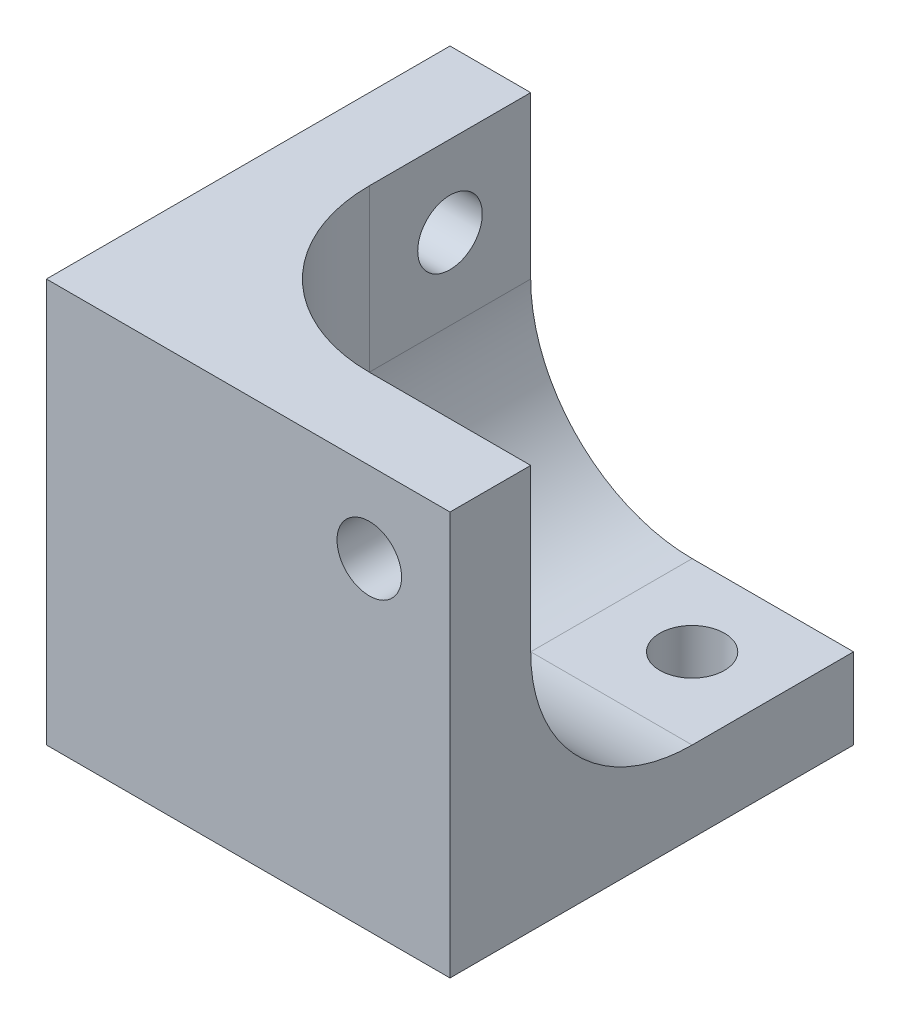
ISO-10303-21;
HEADER;
FILE_DESCRIPTION(('STEP AP214'),'2;1');
FILE_NAME('part.step','',(''),(''),'','','');
FILE_SCHEMA(('AUTOMOTIVE_DESIGN { 1 0 10303 214 1 1 1 1 }'));
ENDSEC;
DATA;
#1=APPLICATION_CONTEXT('core data for automotive mechanical design processes');
#2=APPLICATION_PROTOCOL_DEFINITION('international standard','automotive_design',2000,#1);
#3=PRODUCT_CONTEXT('',#1,'mechanical');
#4=PRODUCT('Part','Part','',(#3));
#5=PRODUCT_RELATED_PRODUCT_CATEGORY('part','',(#4));
#6=PRODUCT_DEFINITION_FORMATION('','',#4);
#7=PRODUCT_DEFINITION_CONTEXT('part definition',#1,'design');
#8=PRODUCT_DEFINITION('design','',#6,#7);
#9=PRODUCT_DEFINITION_SHAPE('','',#8);
#10=(LENGTH_UNIT() NAMED_UNIT(*) SI_UNIT(.MILLI.,.METRE.));
#11=(NAMED_UNIT(*) PLANE_ANGLE_UNIT() SI_UNIT($,.RADIAN.));
#12=(NAMED_UNIT(*) SI_UNIT($,.STERADIAN.) SOLID_ANGLE_UNIT());
#13=UNCERTAINTY_MEASURE_WITH_UNIT(LENGTH_MEASURE(1.E-05),#10,'distance_accuracy_value','');
#14=(GEOMETRIC_REPRESENTATION_CONTEXT(3) GLOBAL_UNCERTAINTY_ASSIGNED_CONTEXT((#13)) GLOBAL_UNIT_ASSIGNED_CONTEXT((#10,
#11,#12)) REPRESENTATION_CONTEXT('',''));
#15=CARTESIAN_POINT('',(0.,0.,0.));
#16=DIRECTION('',(0.,0.,1.));
#17=DIRECTION('',(1.,0.,0.));
#18=AXIS2_PLACEMENT_3D('',#15,#16,#17);
#19=CARTESIAN_POINT('',(0.,50.,0.));
#20=DIRECTION('',(1.,0.,0.));
#21=DIRECTION('',(0.,0.,-1.));
#22=AXIS2_PLACEMENT_3D('',#19,#20,#21);
#23=PLANE('',#22);
#24=CARTESIAN_POINT('',(0.,40.,-40.));
#25=DIRECTION('',(-1.,0.,0.));
#26=DIRECTION('',(0.,0.,1.));
#27=AXIS2_PLACEMENT_3D('',#24,#25,#26);
#28=CIRCLE('',#27,4.00000000000001);
#29=CARTESIAN_POINT('',(0.,40.,-36.));
#30=VERTEX_POINT('',#29);
#31=EDGE_CURVE('E155',#30,#30,#28,.T.);
#32=ORIENTED_EDGE('',*,*,#31,.F.);
#33=EDGE_LOOP('',(#32));
#34=FACE_BOUND('',#33,.T.);
#35=DIRECTION('',(0.,0.,1.));
#36=VECTOR('',#35,1.);
#37=CARTESIAN_POINT('',(0.,0.,0.));
#38=LINE('',#37,#36);
#39=CARTESIAN_POINT('',(0.,0.,-50.));
#40=VERTEX_POINT('',#39);
#41=CARTESIAN_POINT('',(0.,0.,0.));
#42=VERTEX_POINT('',#41);
#43=EDGE_CURVE('E197',#40,#42,#38,.T.);
#44=ORIENTED_EDGE('',*,*,#43,.T.);
#45=DIRECTION('',(0.,-1.,0.));
#46=VECTOR('',#45,1.);
#47=CARTESIAN_POINT('',(0.,50.,0.));
#48=LINE('',#47,#46);
#49=CARTESIAN_POINT('',(0.,50.,0.));
#50=VERTEX_POINT('',#49);
#51=EDGE_CURVE('E137',#50,#42,#48,.T.);
#52=ORIENTED_EDGE('',*,*,#51,.F.);
#53=DIRECTION('',(0.,0.,1.));
#54=VECTOR('',#53,1.);
#55=CARTESIAN_POINT('',(0.,50.,0.));
#56=LINE('',#55,#54);
#57=CARTESIAN_POINT('',(0.,50.,-50.));
#58=VERTEX_POINT('',#57);
#59=EDGE_CURVE('E199',#58,#50,#56,.T.);
#60=ORIENTED_EDGE('',*,*,#59,.F.);
#61=DIRECTION('',(0.,-1.,0.));
#62=VECTOR('',#61,1.);
#63=CARTESIAN_POINT('',(0.,50.,-50.));
#64=LINE('',#63,#62);
#65=EDGE_CURVE('E135',#58,#40,#64,.T.);
#66=ORIENTED_EDGE('',*,*,#65,.T.);
#67=EDGE_LOOP('',(#44,#52,#60,#66));
#68=FACE_BOUND('',#67,.T.);
#69=ADVANCED_FACE('F35',(#34,#68),#23,.F.);
#70=CARTESIAN_POINT('',(0.,50.,0.));
#71=DIRECTION('',(0.,0.,-1.));
#72=DIRECTION('',(-1.,0.,0.));
#73=AXIS2_PLACEMENT_3D('',#70,#71,#72);
#74=PLANE('',#73);
#75=CARTESIAN_POINT('',(40.,40.,0.));
#76=DIRECTION('',(0.,0.,1.));
#77=DIRECTION('',(1.,0.,0.));
#78=AXIS2_PLACEMENT_3D('',#75,#76,#77);
#79=CIRCLE('',#78,4.00000000000001);
#80=CARTESIAN_POINT('',(44.,40.,0.));
#81=VERTEX_POINT('',#80);
#82=EDGE_CURVE('E151',#81,#81,#79,.T.);
#83=ORIENTED_EDGE('',*,*,#82,.F.);
#84=EDGE_LOOP('',(#83));
#85=FACE_BOUND('',#84,.T.);
#86=DIRECTION('',(1.,0.,0.));
#87=VECTOR('',#86,1.);
#88=CARTESIAN_POINT('',(0.,0.,0.));
#89=LINE('',#88,#87);
#90=CARTESIAN_POINT('',(50.,0.,0.));
#91=VERTEX_POINT('',#90);
#92=EDGE_CURVE('E211',#42,#91,#89,.T.);
#93=ORIENTED_EDGE('',*,*,#92,.T.);
#94=DIRECTION('',(0.,-1.,0.));
#95=VECTOR('',#94,1.);
#96=CARTESIAN_POINT('',(50.,50.,0.));
#97=LINE('',#96,#95);
#98=CARTESIAN_POINT('',(50.,50.,0.));
#99=VERTEX_POINT('',#98);
#100=EDGE_CURVE('E134',#99,#91,#97,.T.);
#101=ORIENTED_EDGE('',*,*,#100,.F.);
#102=DIRECTION('',(1.,0.,0.));
#103=VECTOR('',#102,1.);
#104=CARTESIAN_POINT('',(0.,50.,0.));
#105=LINE('',#104,#103);
#106=EDGE_CURVE('E202',#50,#99,#105,.T.);
#107=ORIENTED_EDGE('',*,*,#106,.F.);
#108=ORIENTED_EDGE('',*,*,#51,.T.);
#109=EDGE_LOOP('',(#93,#101,#107,#108));
#110=FACE_BOUND('',#109,.T.);
#111=ADVANCED_FACE('F222',(#85,#110),#74,.F.);
#112=CARTESIAN_POINT('',(50.,50.,0.));
#113=DIRECTION('',(-1.,0.,0.));
#114=DIRECTION('',(0.,0.,1.));
#115=AXIS2_PLACEMENT_3D('',#112,#113,#114);
#116=PLANE('',#115);
#117=DIRECTION('',(0.,0.,-1.));
#118=VECTOR('',#117,1.);
#119=CARTESIAN_POINT('',(50.,10.,-50.));
#120=LINE('',#119,#118);
#121=CARTESIAN_POINT('',(50.,10.,-30.));
#122=VERTEX_POINT('',#121);
#123=CARTESIAN_POINT('',(50.,10.,-50.));
#124=VERTEX_POINT('',#123);
#125=EDGE_CURVE('E109',#122,#124,#120,.T.);
#126=ORIENTED_EDGE('',*,*,#125,.F.);
#127=CARTESIAN_POINT('',(50.,30.,-30.));
#128=DIRECTION('',(-1.,0.,0.));
#129=DIRECTION('',(0.,0.,1.));
#130=AXIS2_PLACEMENT_3D('',#127,#128,#129);
#131=CIRCLE('',#130,20.);
#132=CARTESIAN_POINT('',(50.,30.,-10.));
#133=VERTEX_POINT('',#132);
#134=EDGE_CURVE('E11',#122,#133,#131,.T.);
#135=ORIENTED_EDGE('',*,*,#134,.T.);
#136=DIRECTION('',(0.,1.,0.));
#137=VECTOR('',#136,1.);
#138=CARTESIAN_POINT('',(50.,10.,-10.));
#139=LINE('',#138,#137);
#140=CARTESIAN_POINT('',(50.,50.,-10.));
#141=VERTEX_POINT('',#140);
#142=EDGE_CURVE('E195',#133,#141,#139,.T.);
#143=ORIENTED_EDGE('',*,*,#142,.T.);
#144=DIRECTION('',(0.,0.,-1.));
#145=VECTOR('',#144,1.);
#146=CARTESIAN_POINT('',(50.,50.,0.));
#147=LINE('',#146,#145);
#148=EDGE_CURVE('E205',#99,#141,#147,.T.);
#149=ORIENTED_EDGE('',*,*,#148,.F.);
#150=ORIENTED_EDGE('',*,*,#100,.T.);
#151=DIRECTION('',(0.,0.,-1.));
#152=VECTOR('',#151,1.);
#153=CARTESIAN_POINT('',(50.,0.,0.));
#154=LINE('',#153,#152);
#155=CARTESIAN_POINT('',(50.,0.,-50.));
#156=VERTEX_POINT('',#155);
#157=EDGE_CURVE('E132',#91,#156,#154,.T.);
#158=ORIENTED_EDGE('',*,*,#157,.T.);
#159=DIRECTION('',(0.,-1.,0.));
#160=VECTOR('',#159,1.);
#161=CARTESIAN_POINT('',(50.,50.,-50.));
#162=LINE('',#161,#160);
#163=EDGE_CURVE('E123',#124,#156,#162,.T.);
#164=ORIENTED_EDGE('',*,*,#163,.F.);
#165=EDGE_LOOP('',(#126,#135,#143,#149,#150,#158,#164));
#166=FACE_BOUND('',#165,.T.);
#167=ADVANCED_FACE('F129',(#166),#116,.F.);
#168=CARTESIAN_POINT('',(0.,50.,-50.));
#169=DIRECTION('',(0.,0.,1.));
#170=DIRECTION('',(1.,0.,0.));
#171=AXIS2_PLACEMENT_3D('',#168,#169,#170);
#172=PLANE('',#171);
#173=DIRECTION('',(-1.,0.,0.));
#174=VECTOR('',#173,1.);
#175=CARTESIAN_POINT('',(0.,50.,-50.));
#176=LINE('',#175,#174);
#177=CARTESIAN_POINT('',(10.,50.,-50.));
#178=VERTEX_POINT('',#177);
#179=EDGE_CURVE('E140',#178,#58,#176,.T.);
#180=ORIENTED_EDGE('',*,*,#179,.F.);
#181=DIRECTION('',(0.,1.,0.));
#182=VECTOR('',#181,1.);
#183=CARTESIAN_POINT('',(10.,10.,-50.));
#184=LINE('',#183,#182);
#185=CARTESIAN_POINT('',(10.,30.,-50.));
#186=VERTEX_POINT('',#185);
#187=EDGE_CURVE('E127',#186,#178,#184,.T.);
#188=ORIENTED_EDGE('',*,*,#187,.F.);
#189=CARTESIAN_POINT('',(30.,30.,-50.));
#190=DIRECTION('',(0.,0.,1.));
#191=DIRECTION('',(1.,0.,0.));
#192=AXIS2_PLACEMENT_3D('',#189,#190,#191);
#193=CIRCLE('',#192,20.);
#194=CARTESIAN_POINT('',(30.,10.,-50.));
#195=VERTEX_POINT('',#194);
#196=EDGE_CURVE('E44',#186,#195,#193,.T.);
#197=ORIENTED_EDGE('',*,*,#196,.T.);
#198=DIRECTION('',(-1.,0.,0.));
#199=VECTOR('',#198,1.);
#200=CARTESIAN_POINT('',(50.,10.,-50.));
#201=LINE('',#200,#199);
#202=EDGE_CURVE('E113',#124,#195,#201,.T.);
#203=ORIENTED_EDGE('',*,*,#202,.F.);
#204=ORIENTED_EDGE('',*,*,#163,.T.);
#205=DIRECTION('',(-1.,0.,0.));
#206=VECTOR('',#205,1.);
#207=CARTESIAN_POINT('',(0.,0.,-50.));
#208=LINE('',#207,#206);
#209=EDGE_CURVE('E203',#156,#40,#208,.T.);
#210=ORIENTED_EDGE('',*,*,#209,.T.);
#211=ORIENTED_EDGE('',*,*,#65,.F.);
#212=EDGE_LOOP('',(#180,#188,#197,#203,#204,#210,#211));
#213=FACE_BOUND('',#212,.T.);
#214=ADVANCED_FACE('F122',(#213),#172,.F.);
#215=CARTESIAN_POINT('',(0.,50.,0.));
#216=DIRECTION('',(0.,-1.,0.));
#217=DIRECTION('',(0.,0.,-1.));
#218=AXIS2_PLACEMENT_3D('',#215,#216,#217);
#219=PLANE('',#218);
#220=ORIENTED_EDGE('',*,*,#148,.T.);
#221=DIRECTION('',(1.,0.,0.));
#222=VECTOR('',#221,1.);
#223=CARTESIAN_POINT('',(50.,50.,-10.));
#224=LINE('',#223,#222);
#225=CARTESIAN_POINT('',(30.,50.,-10.));
#226=VERTEX_POINT('',#225);
#227=EDGE_CURVE('E118',#226,#141,#224,.T.);
#228=ORIENTED_EDGE('',*,*,#227,.F.);
#229=CARTESIAN_POINT('',(30.,50.,-30.));
#230=DIRECTION('',(0.,-1.,0.));
#231=DIRECTION('',(0.,0.,-1.));
#232=AXIS2_PLACEMENT_3D('',#229,#230,#231);
#233=CIRCLE('',#232,20.);
#234=CARTESIAN_POINT('',(10.,50.,-30.));
#235=VERTEX_POINT('',#234);
#236=EDGE_CURVE('E160',#226,#235,#233,.T.);
#237=ORIENTED_EDGE('',*,*,#236,.T.);
#238=DIRECTION('',(0.,0.,1.));
#239=VECTOR('',#238,1.);
#240=CARTESIAN_POINT('',(10.,50.,-50.));
#241=LINE('',#240,#239);
#242=EDGE_CURVE('E189',#178,#235,#241,.T.);
#243=ORIENTED_EDGE('',*,*,#242,.F.);
#244=ORIENTED_EDGE('',*,*,#179,.T.);
#245=ORIENTED_EDGE('',*,*,#59,.T.);
#246=ORIENTED_EDGE('',*,*,#106,.T.);
#247=EDGE_LOOP('',(#220,#228,#237,#243,#244,#245,#246));
#248=FACE_BOUND('',#247,.T.);
#249=ADVANCED_FACE('F225',(#248),#219,.F.);
#250=CARTESIAN_POINT('',(0.,0.,0.));
#251=DIRECTION('',(0.,-1.,0.));
#252=DIRECTION('',(0.,0.,-1.));
#253=AXIS2_PLACEMENT_3D('',#250,#251,#252);
#254=PLANE('',#253);
#255=CARTESIAN_POINT('',(40.,0.,-40.));
#256=DIRECTION('',(0.,-1.,0.));
#257=DIRECTION('',(0.,0.,-1.));
#258=AXIS2_PLACEMENT_3D('',#255,#256,#257);
#259=CIRCLE('',#258,4.00000000000001);
#260=CARTESIAN_POINT('',(40.,0.,-44.));
#261=VERTEX_POINT('',#260);
#262=EDGE_CURVE('E187',#261,#261,#259,.T.);
#263=ORIENTED_EDGE('',*,*,#262,.F.);
#264=EDGE_LOOP('',(#263));
#265=FACE_BOUND('',#264,.T.);
#266=ORIENTED_EDGE('',*,*,#43,.F.);
#267=ORIENTED_EDGE('',*,*,#209,.F.);
#268=ORIENTED_EDGE('',*,*,#157,.F.);
#269=ORIENTED_EDGE('',*,*,#92,.F.);
#270=EDGE_LOOP('',(#266,#267,#268,#269));
#271=FACE_BOUND('',#270,.T.);
#272=ADVANCED_FACE('F219',(#265,#271),#254,.T.);
#273=CARTESIAN_POINT('',(50.,10.,-10.));
#274=DIRECTION('',(0.,0.,1.));
#275=DIRECTION('',(1.,0.,0.));
#276=AXIS2_PLACEMENT_3D('',#273,#274,#275);
#277=PLANE('',#276);
#278=CARTESIAN_POINT('',(40.,40.,-10.));
#279=DIRECTION('',(0.,0.,1.));
#280=DIRECTION('',(1.,0.,0.));
#281=AXIS2_PLACEMENT_3D('',#278,#279,#280);
#282=CIRCLE('',#281,4.00000000000001);
#283=CARTESIAN_POINT('',(44.,40.,-10.));
#284=VERTEX_POINT('',#283);
#285=EDGE_CURVE('E147',#284,#284,#282,.T.);
#286=ORIENTED_EDGE('',*,*,#285,.T.);
#287=EDGE_LOOP('',(#286));
#288=FACE_BOUND('',#287,.T.);
#289=ORIENTED_EDGE('',*,*,#142,.F.);
#290=DIRECTION('',(1.,0.,0.));
#291=VECTOR('',#290,1.);
#292=CARTESIAN_POINT('',(30.,30.,-10.));
#293=LINE('',#292,#291);
#294=CARTESIAN_POINT('',(30.,30.,-10.));
#295=VERTEX_POINT('',#294);
#296=EDGE_CURVE('E57',#133,#295,#293,.F.);
#297=ORIENTED_EDGE('',*,*,#296,.T.);
#298=DIRECTION('',(0.,1.,0.));
#299=VECTOR('',#298,1.);
#300=CARTESIAN_POINT('',(30.,50.,-10.));
#301=LINE('',#300,#299);
#302=EDGE_CURVE('E146',#295,#226,#301,.T.);
#303=ORIENTED_EDGE('',*,*,#302,.T.);
#304=ORIENTED_EDGE('',*,*,#227,.T.);
#305=EDGE_LOOP('',(#289,#297,#303,#304));
#306=FACE_BOUND('',#305,.T.);
#307=ADVANCED_FACE('F236',(#288,#306),#277,.F.);
#308=CARTESIAN_POINT('',(10.,10.,-50.));
#309=DIRECTION('',(-1.,0.,0.));
#310=DIRECTION('',(0.,0.,1.));
#311=AXIS2_PLACEMENT_3D('',#308,#309,#310);
#312=PLANE('',#311);
#313=CARTESIAN_POINT('',(9.99999999999999,40.,-40.));
#314=DIRECTION('',(-1.,0.,0.));
#315=DIRECTION('',(0.,0.,1.));
#316=AXIS2_PLACEMENT_3D('',#313,#314,#315);
#317=CIRCLE('',#316,4.00000000000001);
#318=CARTESIAN_POINT('',(9.99999999999999,40.,-36.));
#319=VERTEX_POINT('',#318);
#320=EDGE_CURVE('E152',#319,#319,#317,.T.);
#321=ORIENTED_EDGE('',*,*,#320,.T.);
#322=EDGE_LOOP('',(#321));
#323=FACE_BOUND('',#322,.T.);
#324=DIRECTION('',(0.,1.,0.));
#325=VECTOR('',#324,1.);
#326=CARTESIAN_POINT('',(10.,10.,-30.));
#327=LINE('',#326,#325);
#328=CARTESIAN_POINT('',(10.,30.,-30.));
#329=VERTEX_POINT('',#328);
#330=EDGE_CURVE('E157',#235,#329,#327,.F.);
#331=ORIENTED_EDGE('',*,*,#330,.T.);
#332=DIRECTION('',(0.,0.,1.));
#333=VECTOR('',#332,1.);
#334=CARTESIAN_POINT('',(10.,30.,-50.));
#335=LINE('',#334,#333);
#336=EDGE_CURVE('E165',#329,#186,#335,.F.);
#337=ORIENTED_EDGE('',*,*,#336,.T.);
#338=ORIENTED_EDGE('',*,*,#187,.T.);
#339=ORIENTED_EDGE('',*,*,#242,.T.);
#340=EDGE_LOOP('',(#331,#337,#338,#339));
#341=FACE_BOUND('',#340,.T.);
#342=ADVANCED_FACE('F234',(#323,#341),#312,.F.);
#343=CARTESIAN_POINT('',(0.,10.,0.));
#344=DIRECTION('',(0.,-1.,0.));
#345=DIRECTION('',(0.,0.,-1.));
#346=AXIS2_PLACEMENT_3D('',#343,#344,#345);
#347=PLANE('',#346);
#348=CARTESIAN_POINT('',(40.,10.,-40.));
#349=DIRECTION('',(0.,1.,0.));
#350=DIRECTION('',(0.,0.,1.));
#351=AXIS2_PLACEMENT_3D('',#348,#349,#350);
#352=CIRCLE('',#351,4.00000000000001);
#353=CARTESIAN_POINT('',(40.,10.,-36.));
#354=VERTEX_POINT('',#353);
#355=EDGE_CURVE('E150',#354,#354,#352,.T.);
#356=ORIENTED_EDGE('',*,*,#355,.F.);
#357=EDGE_LOOP('',(#356));
#358=FACE_BOUND('',#357,.T.);
#359=ORIENTED_EDGE('',*,*,#202,.T.);
#360=DIRECTION('',(0.,0.,1.));
#361=VECTOR('',#360,1.);
#362=CARTESIAN_POINT('',(30.,10.,-30.));
#363=LINE('',#362,#361);
#364=CARTESIAN_POINT('',(30.,10.,-30.));
#365=VERTEX_POINT('',#364);
#366=EDGE_CURVE('E163',#195,#365,#363,.T.);
#367=ORIENTED_EDGE('',*,*,#366,.T.);
#368=DIRECTION('',(1.,0.,0.));
#369=VECTOR('',#368,1.);
#370=CARTESIAN_POINT('',(50.,10.,-30.));
#371=LINE('',#370,#369);
#372=EDGE_CURVE('E116',#365,#122,#371,.T.);
#373=ORIENTED_EDGE('',*,*,#372,.T.);
#374=ORIENTED_EDGE('',*,*,#125,.T.);
#375=EDGE_LOOP('',(#359,#367,#373,#374));
#376=FACE_BOUND('',#375,.T.);
#377=ADVANCED_FACE('F111',(#358,#376),#347,.F.);
#378=CARTESIAN_POINT('',(40.,-30.,-40.));
#379=DIRECTION('',(0.,1.,0.));
#380=DIRECTION('',(0.,0.,1.));
#381=AXIS2_PLACEMENT_3D('',#378,#379,#380);
#382=CYLINDRICAL_SURFACE('',#381,4.00000000000001);
#383=ORIENTED_EDGE('',*,*,#262,.T.);
#384=EDGE_LOOP('',(#383));
#385=FACE_BOUND('',#384,.T.);
#386=ORIENTED_EDGE('',*,*,#355,.T.);
#387=EDGE_LOOP('',(#386));
#388=FACE_BOUND('',#387,.T.);
#389=ADVANCED_FACE('F243',(#385,#388),#382,.F.);
#390=CARTESIAN_POINT('',(40.,40.,-40.));
#391=DIRECTION('',(0.,0.,1.));
#392=DIRECTION('',(1.,0.,0.));
#393=AXIS2_PLACEMENT_3D('',#390,#391,#392);
#394=CYLINDRICAL_SURFACE('',#393,4.00000000000001);
#395=ORIENTED_EDGE('',*,*,#82,.T.);
#396=EDGE_LOOP('',(#395));
#397=FACE_BOUND('',#396,.T.);
#398=ORIENTED_EDGE('',*,*,#285,.F.);
#399=EDGE_LOOP('',(#398));
#400=FACE_BOUND('',#399,.T.);
#401=ADVANCED_FACE('F281',(#397,#400),#394,.F.);
#402=CARTESIAN_POINT('',(40.,40.,-40.));
#403=DIRECTION('',(-1.,0.,0.));
#404=DIRECTION('',(0.,0.,1.));
#405=AXIS2_PLACEMENT_3D('',#402,#403,#404);
#406=CYLINDRICAL_SURFACE('',#405,4.00000000000001);
#407=ORIENTED_EDGE('',*,*,#31,.T.);
#408=EDGE_LOOP('',(#407));
#409=FACE_BOUND('',#408,.T.);
#410=ORIENTED_EDGE('',*,*,#320,.F.);
#411=EDGE_LOOP('',(#410));
#412=FACE_BOUND('',#411,.T.);
#413=ADVANCED_FACE('F261',(#409,#412),#406,.F.);
#414=CARTESIAN_POINT('',(30.,10.,-30.));
#415=DIRECTION('',(0.,-1.,0.));
#416=DIRECTION('',(0.,0.,-1.));
#417=AXIS2_PLACEMENT_3D('',#414,#415,#416);
#418=CYLINDRICAL_SURFACE('',#417,20.);
#419=ORIENTED_EDGE('',*,*,#302,.F.);
#420=CARTESIAN_POINT('',(30.,30.,-30.));
#421=DIRECTION('',(0.,-1.,0.));
#422=DIRECTION('',(0.,0.,-1.));
#423=AXIS2_PLACEMENT_3D('',#420,#421,#422);
#424=CIRCLE('',#423,20.);
#425=EDGE_CURVE('E167',#295,#329,#424,.T.);
#426=ORIENTED_EDGE('',*,*,#425,.T.);
#427=ORIENTED_EDGE('',*,*,#330,.F.);
#428=ORIENTED_EDGE('',*,*,#236,.F.);
#429=EDGE_LOOP('',(#419,#426,#427,#428));
#430=FACE_BOUND('',#429,.T.);
#431=ADVANCED_FACE('F232',(#430),#418,.F.);
#432=CARTESIAN_POINT('',(0.,30.,-30.));
#433=DIRECTION('',(-1.,0.,0.));
#434=DIRECTION('',(0.,0.,1.));
#435=AXIS2_PLACEMENT_3D('',#432,#433,#434);
#436=CYLINDRICAL_SURFACE('',#435,20.);
#437=CARTESIAN_POINT('',(30.,30.,-30.));
#438=DIRECTION('',(1.,0.,0.));
#439=DIRECTION('',(0.,0.,-1.));
#440=AXIS2_PLACEMENT_3D('',#437,#438,#439);
#441=CIRCLE('',#440,20.);
#442=EDGE_CURVE('E39',#295,#365,#441,.T.);
#443=ORIENTED_EDGE('',*,*,#442,.F.);
#444=ORIENTED_EDGE('',*,*,#296,.F.);
#445=ORIENTED_EDGE('',*,*,#134,.F.);
#446=ORIENTED_EDGE('',*,*,#372,.F.);
#447=EDGE_LOOP('',(#443,#444,#445,#446));
#448=FACE_BOUND('',#447,.T.);
#449=ADVANCED_FACE('F37',(#448),#436,.F.);
#450=CARTESIAN_POINT('',(30.,30.,-30.));
#451=DIRECTION('',(0.,-1.,0.));
#452=DIRECTION('',(0.,0.,-1.));
#453=AXIS2_PLACEMENT_3D('',#450,#451,#452);
#454=SPHERICAL_SURFACE('',#453,20.);
#455=ORIENTED_EDGE('',*,*,#425,.F.);
#456=ORIENTED_EDGE('',*,*,#442,.T.);
#457=CARTESIAN_POINT('',(30.,30.,-30.));
#458=DIRECTION('',(0.,0.,1.));
#459=DIRECTION('',(1.,0.,0.));
#460=AXIS2_PLACEMENT_3D('',#457,#458,#459);
#461=CIRCLE('',#460,20.);
#462=EDGE_CURVE('E170',#329,#365,#461,.T.);
#463=ORIENTED_EDGE('',*,*,#462,.F.);
#464=EDGE_LOOP('',(#455,#456,#463));
#465=FACE_BOUND('',#464,.T.);
#466=ADVANCED_FACE('F229',(#465),#454,.F.);
#467=CARTESIAN_POINT('',(30.,30.,0.));
#468=DIRECTION('',(0.,0.,-1.));
#469=DIRECTION('',(-1.,0.,0.));
#470=AXIS2_PLACEMENT_3D('',#467,#468,#469);
#471=CYLINDRICAL_SURFACE('',#470,20.);
#472=ORIENTED_EDGE('',*,*,#196,.F.);
#473=ORIENTED_EDGE('',*,*,#336,.F.);
#474=ORIENTED_EDGE('',*,*,#462,.T.);
#475=ORIENTED_EDGE('',*,*,#366,.F.);
#476=EDGE_LOOP('',(#472,#473,#474,#475));
#477=FACE_BOUND('',#476,.T.);
#478=ADVANCED_FACE('F228',(#477),#471,.F.);
#479=CLOSED_SHELL('',(#69,#111,#167,#214,#249,#272,#307,#342,#377,#389,#401,#413,#431,#449,#466,#478));
#480=MANIFOLD_SOLID_BREP('B2',#479);
#481=ADVANCED_BREP_SHAPE_REPRESENTATION('',(#18,#480),#14);
#482=SHAPE_DEFINITION_REPRESENTATION(#9,#481);
ENDSEC;
END-ISO-10303-21;
